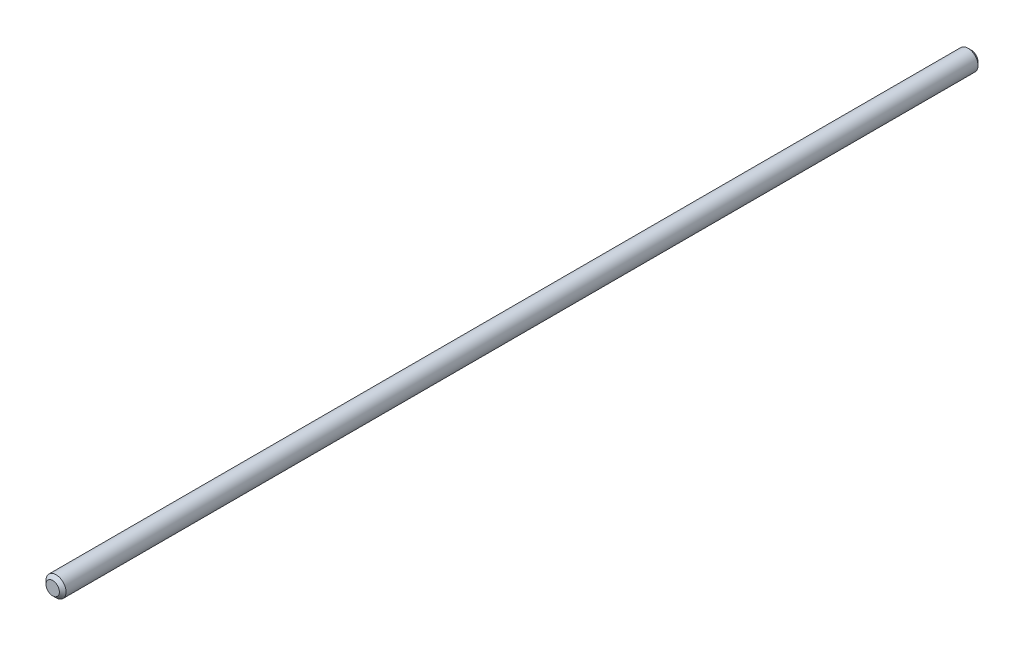
ISO-10303-21;
HEADER;
FILE_DESCRIPTION(('STEP AP214'),'2;1');
FILE_NAME('part.step','',(''),(''),'','','');
FILE_SCHEMA(('AUTOMOTIVE_DESIGN { 1 0 10303 214 1 1 1 1 }'));
ENDSEC;
DATA;
#1=APPLICATION_CONTEXT('core data for automotive mechanical design processes');
#2=APPLICATION_PROTOCOL_DEFINITION('international standard','automotive_design',2000,#1);
#3=PRODUCT_CONTEXT('',#1,'mechanical');
#4=PRODUCT('Part','Part','',(#3));
#5=PRODUCT_RELATED_PRODUCT_CATEGORY('part','',(#4));
#6=PRODUCT_DEFINITION_FORMATION('','',#4);
#7=PRODUCT_DEFINITION_CONTEXT('part definition',#1,'design');
#8=PRODUCT_DEFINITION('design','',#6,#7);
#9=PRODUCT_DEFINITION_SHAPE('','',#8);
#10=(LENGTH_UNIT() NAMED_UNIT(*) SI_UNIT(.MILLI.,.METRE.));
#11=(NAMED_UNIT(*) PLANE_ANGLE_UNIT() SI_UNIT($,.RADIAN.));
#12=(NAMED_UNIT(*) SI_UNIT($,.STERADIAN.) SOLID_ANGLE_UNIT());
#13=UNCERTAINTY_MEASURE_WITH_UNIT(LENGTH_MEASURE(1.E-05),#10,'distance_accuracy_value','');
#14=(GEOMETRIC_REPRESENTATION_CONTEXT(3) GLOBAL_UNCERTAINTY_ASSIGNED_CONTEXT((#13)) GLOBAL_UNIT_ASSIGNED_CONTEXT((#10,
#11,#12)) REPRESENTATION_CONTEXT('',''));
#15=CARTESIAN_POINT('',(0.,0.,0.));
#16=DIRECTION('',(0.,0.,1.));
#17=DIRECTION('',(1.,0.,0.));
#18=AXIS2_PLACEMENT_3D('',#15,#16,#17);
#19=CARTESIAN_POINT('',(0.,0.,275.));
#20=DIRECTION('',(0.,0.,-1.));
#21=DIRECTION('',(-1.,0.,0.));
#22=AXIS2_PLACEMENT_3D('',#19,#20,#21);
#23=CYLINDRICAL_SURFACE('',#22,3.);
#24=CARTESIAN_POINT('',(0.,0.,274.));
#25=DIRECTION('',(0.,0.,1.));
#26=DIRECTION('',(1.,0.,0.));
#27=AXIS2_PLACEMENT_3D('',#24,#25,#26);
#28=CIRCLE('',#27,3.);
#29=CARTESIAN_POINT('',(3.,0.,274.));
#30=VERTEX_POINT('',#29);
#31=EDGE_CURVE('E36',#30,#30,#28,.F.);
#32=ORIENTED_EDGE('',*,*,#31,.T.);
#33=EDGE_LOOP('',(#32));
#34=FACE_BOUND('',#33,.T.);
#35=CARTESIAN_POINT('',(0.,0.,1.00000000000006));
#36=DIRECTION('',(0.,0.,1.));
#37=DIRECTION('',(1.,0.,0.));
#38=AXIS2_PLACEMENT_3D('',#35,#36,#37);
#39=CIRCLE('',#38,3.);
#40=CARTESIAN_POINT('',(3.,0.,1.00000000000006));
#41=VERTEX_POINT('',#40);
#42=EDGE_CURVE('E40',#41,#41,#39,.T.);
#43=ORIENTED_EDGE('',*,*,#42,.T.);
#44=EDGE_LOOP('',(#43));
#45=FACE_BOUND('',#44,.T.);
#46=ADVANCED_FACE('F29',(#34,#45),#23,.T.);
#47=CARTESIAN_POINT('',(0.,0.,275.));
#48=DIRECTION('',(0.,0.,1.));
#49=DIRECTION('',(1.,0.,0.));
#50=AXIS2_PLACEMENT_3D('',#47,#48,#49);
#51=PLANE('',#50);
#52=CARTESIAN_POINT('',(0.,0.,275.));
#53=DIRECTION('',(0.,0.,1.));
#54=DIRECTION('',(1.,0.,0.));
#55=AXIS2_PLACEMENT_3D('',#52,#53,#54);
#56=CIRCLE('',#55,2.);
#57=CARTESIAN_POINT('',(2.,0.,275.));
#58=VERTEX_POINT('',#57);
#59=EDGE_CURVE('E44',#58,#58,#56,.T.);
#60=ORIENTED_EDGE('',*,*,#59,.T.);
#61=EDGE_LOOP('',(#60));
#62=FACE_BOUND('',#61,.T.);
#63=ADVANCED_FACE('F50',(#62),#51,.T.);
#64=CARTESIAN_POINT('',(0.,0.,0.));
#65=DIRECTION('',(0.,0.,1.));
#66=DIRECTION('',(1.,0.,0.));
#67=AXIS2_PLACEMENT_3D('',#64,#65,#66);
#68=PLANE('',#67);
#69=CARTESIAN_POINT('',(0.,0.,0.));
#70=DIRECTION('',(0.,0.,1.));
#71=DIRECTION('',(1.,0.,0.));
#72=AXIS2_PLACEMENT_3D('',#69,#70,#71);
#73=CIRCLE('',#72,1.99999999999997);
#74=CARTESIAN_POINT('',(1.99999999999997,0.,0.));
#75=VERTEX_POINT('',#74);
#76=EDGE_CURVE('E10',#75,#75,#73,.F.);
#77=ORIENTED_EDGE('',*,*,#76,.T.);
#78=EDGE_LOOP('',(#77));
#79=FACE_BOUND('',#78,.T.);
#80=ADVANCED_FACE('F54',(#79),#68,.F.);
#81=CARTESIAN_POINT('',(0.,0.,275.));
#82=DIRECTION('',(0.,0.,-1.));
#83=DIRECTION('',(-1.,0.,0.));
#84=AXIS2_PLACEMENT_3D('',#81,#82,#83);
#85=CONICAL_SURFACE('',#84,2.,0.785398163397447);
#86=ORIENTED_EDGE('',*,*,#31,.F.);
#87=EDGE_LOOP('',(#86));
#88=FACE_BOUND('',#87,.T.);
#89=ORIENTED_EDGE('',*,*,#59,.F.);
#90=EDGE_LOOP('',(#89));
#91=FACE_BOUND('',#90,.T.);
#92=ADVANCED_FACE('F52',(#88,#91),#85,.T.);
#93=CARTESIAN_POINT('',(0.,0.,1.00000000000006));
#94=DIRECTION('',(0.,0.,1.));
#95=DIRECTION('',(1.,0.,0.));
#96=AXIS2_PLACEMENT_3D('',#93,#94,#95);
#97=CONICAL_SURFACE('',#96,3.,0.785398163397433);
#98=ORIENTED_EDGE('',*,*,#76,.F.);
#99=EDGE_LOOP('',(#98));
#100=FACE_BOUND('',#99,.T.);
#101=ORIENTED_EDGE('',*,*,#42,.F.);
#102=EDGE_LOOP('',(#101));
#103=FACE_BOUND('',#102,.T.);
#104=ADVANCED_FACE('F31',(#100,#103),#97,.T.);
#105=CLOSED_SHELL('',(#46,#63,#80,#92,#104));
#106=MANIFOLD_SOLID_BREP('B2',#105);
#107=ADVANCED_BREP_SHAPE_REPRESENTATION('',(#18,#106),#14);
#108=SHAPE_DEFINITION_REPRESENTATION(#9,#107);
ENDSEC;
END-ISO-10303-21;
